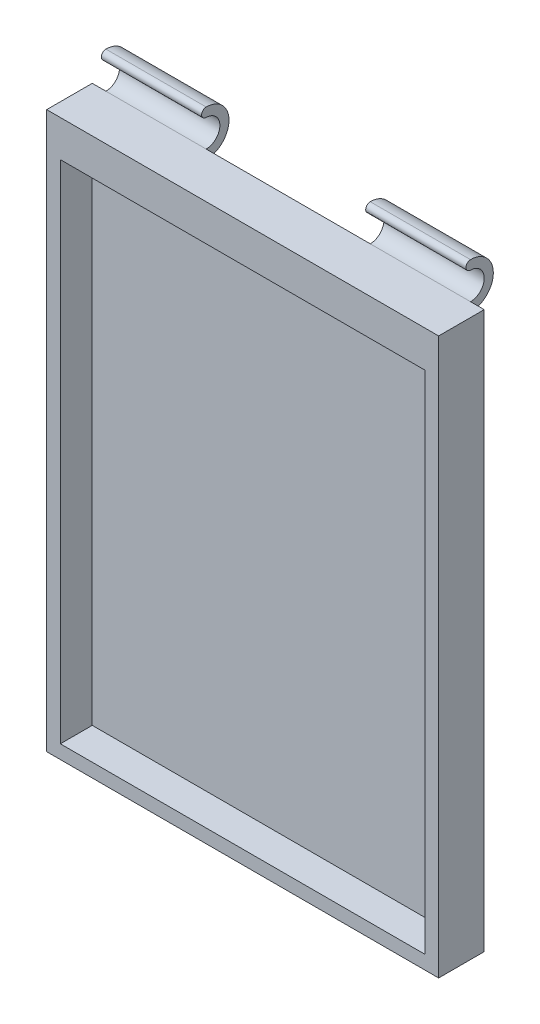
ISO-10303-21;
HEADER;
FILE_DESCRIPTION(('STEP AP214'),'2;1');
FILE_NAME('part.step','',(''),(''),'','','');
FILE_SCHEMA(('AUTOMOTIVE_DESIGN { 1 0 10303 214 1 1 1 1 }'));
ENDSEC;
DATA;
#1=APPLICATION_CONTEXT('core data for automotive mechanical design processes');
#2=APPLICATION_PROTOCOL_DEFINITION('international standard','automotive_design',2000,#1);
#3=PRODUCT_CONTEXT('',#1,'mechanical');
#4=PRODUCT('Part','Part','',(#3));
#5=PRODUCT_RELATED_PRODUCT_CATEGORY('part','',(#4));
#6=PRODUCT_DEFINITION_FORMATION('','',#4);
#7=PRODUCT_DEFINITION_CONTEXT('part definition',#1,'design');
#8=PRODUCT_DEFINITION('design','',#6,#7);
#9=PRODUCT_DEFINITION_SHAPE('','',#8);
#10=(LENGTH_UNIT() NAMED_UNIT(*) SI_UNIT(.MILLI.,.METRE.));
#11=(NAMED_UNIT(*) PLANE_ANGLE_UNIT() SI_UNIT($,.RADIAN.));
#12=(NAMED_UNIT(*) SI_UNIT($,.STERADIAN.) SOLID_ANGLE_UNIT());
#13=UNCERTAINTY_MEASURE_WITH_UNIT(LENGTH_MEASURE(1.E-05),#10,'distance_accuracy_value','');
#14=(GEOMETRIC_REPRESENTATION_CONTEXT(3) GLOBAL_UNCERTAINTY_ASSIGNED_CONTEXT((#13)) GLOBAL_UNIT_ASSIGNED_CONTEXT((#10,
#11,#12)) REPRESENTATION_CONTEXT('',''));
#15=CARTESIAN_POINT('',(0.,0.,0.));
#16=DIRECTION('',(0.,0.,1.));
#17=DIRECTION('',(1.,0.,0.));
#18=AXIS2_PLACEMENT_3D('',#15,#16,#17);
#19=CARTESIAN_POINT('',(-59.8956587101312,85.6025891829689,0.));
#20=DIRECTION('',(1.,0.,0.));
#21=DIRECTION('',(0.,0.,-1.));
#22=AXIS2_PLACEMENT_3D('',#19,#20,#21);
#23=CYLINDRICAL_SURFACE('',#22,5.);
#24=DIRECTION('',(1.,0.,0.));
#25=VECTOR('',#24,1.);
#26=CARTESIAN_POINT('',(-59.8956587101312,80.6025891829689,0.));
#27=LINE('',#26,#25);
#28=CARTESIAN_POINT('',(-37.046225468852,80.6025891829689,0.));
#29=VERTEX_POINT('',#28);
#30=CARTESIAN_POINT('',(-15.046225468852,80.6025891829689,0.));
#31=VERTEX_POINT('',#30);
#32=EDGE_CURVE('E164',#29,#31,#27,.T.);
#33=ORIENTED_EDGE('',*,*,#32,.F.);
#34=CARTESIAN_POINT('',(-37.046225468852,85.6025891829689,0.));
#35=DIRECTION('',(-1.,0.,0.));
#36=DIRECTION('',(0.,0.,1.));
#37=AXIS2_PLACEMENT_3D('',#34,#35,#36);
#38=CIRCLE('',#37,5.);
#39=CARTESIAN_POINT('',(-37.046225468852,90.6025891829689,0.));
#40=VERTEX_POINT('',#39);
#41=EDGE_CURVE('E11',#29,#40,#38,.F.);
#42=ORIENTED_EDGE('',*,*,#41,.T.);
#43=DIRECTION('',(1.,0.,0.));
#44=VECTOR('',#43,1.);
#45=CARTESIAN_POINT('',(-59.8956587101312,90.6025891829689,0.));
#46=LINE('',#45,#44);
#47=CARTESIAN_POINT('',(-15.046225468852,90.6025891829689,0.));
#48=VERTEX_POINT('',#47);
#49=EDGE_CURVE('E174',#40,#48,#46,.T.);
#50=ORIENTED_EDGE('',*,*,#49,.T.);
#51=CARTESIAN_POINT('',(-15.046225468852,85.6025891829689,0.));
#52=DIRECTION('',(1.,0.,0.));
#53=DIRECTION('',(0.,0.,-1.));
#54=AXIS2_PLACEMENT_3D('',#51,#52,#53);
#55=CIRCLE('',#54,5.);
#56=EDGE_CURVE('E44',#48,#31,#55,.F.);
#57=ORIENTED_EDGE('',*,*,#56,.T.);
#58=EDGE_LOOP('',(#33,#42,#50,#57));
#59=FACE_BOUND('',#58,.T.);
#60=ADVANCED_FACE('F36',(#59),#23,.T.);
#61=CARTESIAN_POINT('',(45.953774531148,77.6025891829689,10.));
#62=DIRECTION('',(-1.,0.,0.));
#63=DIRECTION('',(0.,0.,1.));
#64=AXIS2_PLACEMENT_3D('',#61,#62,#63);
#65=PLANE('',#64);
#66=DIRECTION('',(0.,1.,0.));
#67=VECTOR('',#66,1.);
#68=CARTESIAN_POINT('',(45.953774531148,77.6025891829689,0.));
#69=LINE('',#68,#67);
#70=CARTESIAN_POINT('',(45.953774531148,-39.3974108170311,0.));
#71=VERTEX_POINT('',#70);
#72=CARTESIAN_POINT('',(45.953774531148,82.6025891829689,0.));
#73=VERTEX_POINT('',#72);
#74=EDGE_CURVE('E210',#71,#73,#69,.T.);
#75=ORIENTED_EDGE('',*,*,#74,.T.);
#76=DIRECTION('',(0.,0.,1.));
#77=VECTOR('',#76,1.);
#78=CARTESIAN_POINT('',(45.953774531148,82.6025891829689,0.));
#79=LINE('',#78,#77);
#80=CARTESIAN_POINT('',(45.953774531148,82.6025891829689,10.));
#81=VERTEX_POINT('',#80);
#82=EDGE_CURVE('E177',#73,#81,#79,.T.);
#83=ORIENTED_EDGE('',*,*,#82,.T.);
#84=DIRECTION('',(0.,1.,0.));
#85=VECTOR('',#84,1.);
#86=CARTESIAN_POINT('',(45.953774531148,77.6025891829689,10.));
#87=LINE('',#86,#85);
#88=CARTESIAN_POINT('',(45.953774531148,-39.3974108170311,10.));
#89=VERTEX_POINT('',#88);
#90=EDGE_CURVE('E212',#89,#81,#87,.T.);
#91=ORIENTED_EDGE('',*,*,#90,.F.);
#92=DIRECTION('',(0.,0.,-1.));
#93=VECTOR('',#92,1.);
#94=CARTESIAN_POINT('',(45.953774531148,-39.3974108170311,10.));
#95=LINE('',#94,#93);
#96=EDGE_CURVE('E215',#89,#71,#95,.T.);
#97=ORIENTED_EDGE('',*,*,#96,.T.);
#98=EDGE_LOOP('',(#75,#83,#91,#97));
#99=FACE_BOUND('',#98,.T.);
#100=ADVANCED_FACE('F318',(#99),#65,.F.);
#101=CARTESIAN_POINT('',(-59.8956587101312,85.6025891829689,0.));
#102=DIRECTION('',(1.,0.,0.));
#103=DIRECTION('',(0.,0.,-1.));
#104=AXIS2_PLACEMENT_3D('',#101,#102,#103);
#105=CYLINDRICAL_SURFACE('',#104,3.);
#106=DIRECTION('',(1.,0.,0.));
#107=VECTOR('',#106,1.);
#108=CARTESIAN_POINT('',(-59.8956587101312,88.6025891829689,0.));
#109=LINE('',#108,#107);
#110=CARTESIAN_POINT('',(-37.046225468852,88.6025891829689,0.));
#111=VERTEX_POINT('',#110);
#112=CARTESIAN_POINT('',(-15.046225468852,88.6025891829689,0.));
#113=VERTEX_POINT('',#112);
#114=EDGE_CURVE('E278',#111,#113,#109,.T.);
#115=ORIENTED_EDGE('',*,*,#114,.F.);
#116=CARTESIAN_POINT('',(-37.046225468852,85.6025891829689,0.));
#117=DIRECTION('',(-1.,0.,0.));
#118=DIRECTION('',(0.,0.,1.));
#119=AXIS2_PLACEMENT_3D('',#116,#117,#118);
#120=CIRCLE('',#119,3.);
#121=CARTESIAN_POINT('',(-37.046225468852,82.6025891829689,0.));
#122=VERTEX_POINT('',#121);
#123=EDGE_CURVE('E267',#111,#122,#120,.T.);
#124=ORIENTED_EDGE('',*,*,#123,.T.);
#125=DIRECTION('',(1.,0.,0.));
#126=VECTOR('',#125,1.);
#127=CARTESIAN_POINT('',(-59.8956587101312,82.6025891829689,0.));
#128=LINE('',#127,#126);
#129=CARTESIAN_POINT('',(-15.046225468852,82.6025891829689,0.));
#130=VERTEX_POINT('',#129);
#131=EDGE_CURVE('E275',#122,#130,#128,.T.);
#132=ORIENTED_EDGE('',*,*,#131,.T.);
#133=CARTESIAN_POINT('',(-15.046225468852,85.6025891829689,0.));
#134=DIRECTION('',(1.,0.,0.));
#135=DIRECTION('',(0.,0.,-1.));
#136=AXIS2_PLACEMENT_3D('',#133,#134,#135);
#137=CIRCLE('',#136,3.);
#138=EDGE_CURVE('E263',#130,#113,#137,.T.);
#139=ORIENTED_EDGE('',*,*,#138,.T.);
#140=EDGE_LOOP('',(#115,#124,#132,#139));
#141=FACE_BOUND('',#140,.T.);
#142=ADVANCED_FACE('F288',(#141),#105,.F.);
#143=CARTESIAN_POINT('',(20.953774531148,88.6025891829689,0.));
#144=VERTEX_POINT('',#143);
#145=CARTESIAN_POINT('',(42.9537745311479,88.6025891829689,0.));
#146=VERTEX_POINT('',#145);
#147=EDGE_CURVE('E249',#144,#146,#109,.T.);
#148=ORIENTED_EDGE('',*,*,#147,.F.);
#149=CARTESIAN_POINT('',(20.953774531148,85.6025891829689,0.));
#150=DIRECTION('',(-1.,0.,0.));
#151=DIRECTION('',(0.,0.,1.));
#152=AXIS2_PLACEMENT_3D('',#149,#150,#151);
#153=CIRCLE('',#152,3.);
#154=CARTESIAN_POINT('',(20.953774531148,82.6025891829689,0.));
#155=VERTEX_POINT('',#154);
#156=EDGE_CURVE('E241',#144,#155,#153,.T.);
#157=ORIENTED_EDGE('',*,*,#156,.T.);
#158=CARTESIAN_POINT('',(42.9537745311479,82.6025891829689,0.));
#159=VERTEX_POINT('',#158);
#160=EDGE_CURVE('E276',#155,#159,#128,.T.);
#161=ORIENTED_EDGE('',*,*,#160,.T.);
#162=CARTESIAN_POINT('',(42.9537745311479,85.6025891829689,0.));
#163=DIRECTION('',(1.,0.,0.));
#164=DIRECTION('',(0.,0.,-1.));
#165=AXIS2_PLACEMENT_3D('',#162,#163,#164);
#166=CIRCLE('',#165,3.);
#167=EDGE_CURVE('E245',#159,#146,#166,.T.);
#168=ORIENTED_EDGE('',*,*,#167,.T.);
#169=EDGE_LOOP('',(#148,#157,#161,#168));
#170=FACE_BOUND('',#169,.T.);
#171=ADVANCED_FACE('F310',(#170),#105,.F.);
#172=CARTESIAN_POINT('',(-59.8956587101312,89.6025891829689,0.));
#173=DIRECTION('',(1.,0.,0.));
#174=DIRECTION('',(0.,0.,-1.));
#175=AXIS2_PLACEMENT_3D('',#172,#173,#174);
#176=CYLINDRICAL_SURFACE('',#175,1.);
#177=ORIENTED_EDGE('',*,*,#49,.F.);
#178=CARTESIAN_POINT('',(-37.046225468852,89.6025891829689,0.));
#179=DIRECTION('',(-1.,0.,0.));
#180=DIRECTION('',(0.,0.,1.));
#181=AXIS2_PLACEMENT_3D('',#178,#179,#180);
#182=CIRCLE('',#181,1.);
#183=EDGE_CURVE('E156',#40,#111,#182,.F.);
#184=ORIENTED_EDGE('',*,*,#183,.T.);
#185=ORIENTED_EDGE('',*,*,#114,.T.);
#186=CARTESIAN_POINT('',(-15.046225468852,89.6025891829689,0.));
#187=DIRECTION('',(1.,0.,0.));
#188=DIRECTION('',(0.,0.,-1.));
#189=AXIS2_PLACEMENT_3D('',#186,#187,#188);
#190=CIRCLE('',#189,1.);
#191=EDGE_CURVE('E260',#113,#48,#190,.F.);
#192=ORIENTED_EDGE('',*,*,#191,.T.);
#193=EDGE_LOOP('',(#177,#184,#185,#192));
#194=FACE_BOUND('',#193,.T.);
#195=ADVANCED_FACE('F281',(#194),#176,.T.);
#196=CARTESIAN_POINT('',(20.953774531148,90.6025891829689,0.));
#197=VERTEX_POINT('',#196);
#198=CARTESIAN_POINT('',(42.9537745311479,90.6025891829689,0.));
#199=VERTEX_POINT('',#198);
#200=EDGE_CURVE('E170',#197,#199,#46,.T.);
#201=ORIENTED_EDGE('',*,*,#200,.F.);
#202=CARTESIAN_POINT('',(20.953774531148,89.6025891829689,0.));
#203=DIRECTION('',(-1.,0.,0.));
#204=DIRECTION('',(0.,0.,1.));
#205=AXIS2_PLACEMENT_3D('',#202,#203,#204);
#206=CIRCLE('',#205,1.);
#207=EDGE_CURVE('E238',#197,#144,#206,.F.);
#208=ORIENTED_EDGE('',*,*,#207,.T.);
#209=ORIENTED_EDGE('',*,*,#147,.T.);
#210=CARTESIAN_POINT('',(42.9537745311479,89.6025891829689,0.));
#211=DIRECTION('',(1.,0.,0.));
#212=DIRECTION('',(0.,0.,-1.));
#213=AXIS2_PLACEMENT_3D('',#210,#211,#212);
#214=CIRCLE('',#213,1.);
#215=EDGE_CURVE('E167',#146,#199,#214,.F.);
#216=ORIENTED_EDGE('',*,*,#215,.T.);
#217=EDGE_LOOP('',(#201,#208,#209,#216));
#218=FACE_BOUND('',#217,.T.);
#219=ADVANCED_FACE('F248',(#218),#176,.T.);
#220=CARTESIAN_POINT('',(42.9537745311479,85.6025891829689,0.));
#221=DIRECTION('',(1.,0.,0.));
#222=DIRECTION('',(0.,0.,-1.));
#223=AXIS2_PLACEMENT_3D('',#220,#221,#222);
#224=CIRCLE('',#223,5.);
#225=CARTESIAN_POINT('',(42.9537745311479,80.6025891829689,0.));
#226=VERTEX_POINT('',#225);
#227=EDGE_CURVE('E226',#199,#226,#224,.F.);
#228=ORIENTED_EDGE('',*,*,#227,.T.);
#229=CARTESIAN_POINT('',(20.953774531148,80.6025891829689,0.));
#230=VERTEX_POINT('',#229);
#231=EDGE_CURVE('E171',#230,#226,#27,.T.);
#232=ORIENTED_EDGE('',*,*,#231,.F.);
#233=CARTESIAN_POINT('',(20.953774531148,85.6025891829689,0.));
#234=DIRECTION('',(-1.,0.,0.));
#235=DIRECTION('',(0.,0.,1.));
#236=AXIS2_PLACEMENT_3D('',#233,#234,#235);
#237=CIRCLE('',#236,5.);
#238=EDGE_CURVE('E228',#230,#197,#237,.F.);
#239=ORIENTED_EDGE('',*,*,#238,.T.);
#240=ORIENTED_EDGE('',*,*,#200,.T.);
#241=EDGE_LOOP('',(#228,#232,#239,#240));
#242=FACE_BOUND('',#241,.T.);
#243=ADVANCED_FACE('F232',(#242),#23,.T.);
#244=CARTESIAN_POINT('',(0.,0.,10.));
#245=DIRECTION('',(0.,0.,1.));
#246=DIRECTION('',(1.,0.,0.));
#247=AXIS2_PLACEMENT_3D('',#244,#245,#246);
#248=PLANE('',#247);
#249=DIRECTION('',(0.,-1.,0.));
#250=VECTOR('',#249,1.);
#251=CARTESIAN_POINT('',(-40.046225468852,77.6025891829689,10.));
#252=LINE('',#251,#250);
#253=CARTESIAN_POINT('',(-40.046225468852,82.6025891829689,10.));
#254=VERTEX_POINT('',#253);
#255=CARTESIAN_POINT('',(-40.046225468852,-39.3974108170311,10.));
#256=VERTEX_POINT('',#255);
#257=EDGE_CURVE('E206',#254,#256,#252,.T.);
#258=ORIENTED_EDGE('',*,*,#257,.T.);
#259=DIRECTION('',(1.,0.,0.));
#260=VECTOR('',#259,1.);
#261=CARTESIAN_POINT('',(-40.046225468852,-39.3974108170311,10.));
#262=LINE('',#261,#260);
#263=EDGE_CURVE('E209',#256,#89,#262,.T.);
#264=ORIENTED_EDGE('',*,*,#263,.T.);
#265=ORIENTED_EDGE('',*,*,#90,.T.);
#266=DIRECTION('',(1.,0.,0.));
#267=VECTOR('',#266,1.);
#268=CARTESIAN_POINT('',(-59.8956587101312,82.6025891829689,10.));
#269=LINE('',#268,#267);
#270=EDGE_CURVE('E271',#254,#81,#269,.T.);
#271=ORIENTED_EDGE('',*,*,#270,.F.);
#272=EDGE_LOOP('',(#258,#264,#265,#271));
#273=FACE_BOUND('',#272,.T.);
#274=DIRECTION('',(1.,0.,0.));
#275=VECTOR('',#274,1.);
#276=CARTESIAN_POINT('',(-37.046225468852,-36.3974108170311,10.));
#277=LINE('',#276,#275);
#278=CARTESIAN_POINT('',(-37.046225468852,-36.3974108170311,10.));
#279=VERTEX_POINT('',#278);
#280=CARTESIAN_POINT('',(42.953774531148,-36.3974108170311,10.));
#281=VERTEX_POINT('',#280);
#282=EDGE_CURVE('E190',#279,#281,#277,.T.);
#283=ORIENTED_EDGE('',*,*,#282,.F.);
#284=DIRECTION('',(0.,-1.,0.));
#285=VECTOR('',#284,1.);
#286=CARTESIAN_POINT('',(-37.046225468852,74.6025891829689,10.));
#287=LINE('',#286,#285);
#288=CARTESIAN_POINT('',(-37.046225468852,74.6025891829689,10.));
#289=VERTEX_POINT('',#288);
#290=EDGE_CURVE('E188',#289,#279,#287,.T.);
#291=ORIENTED_EDGE('',*,*,#290,.F.);
#292=DIRECTION('',(-1.,0.,0.));
#293=VECTOR('',#292,1.);
#294=CARTESIAN_POINT('',(-37.046225468852,74.6025891829689,10.));
#295=LINE('',#294,#293);
#296=CARTESIAN_POINT('',(42.953774531148,74.6025891829689,10.));
#297=VERTEX_POINT('',#296);
#298=EDGE_CURVE('E195',#297,#289,#295,.T.);
#299=ORIENTED_EDGE('',*,*,#298,.F.);
#300=DIRECTION('',(0.,1.,0.));
#301=VECTOR('',#300,1.);
#302=CARTESIAN_POINT('',(42.953774531148,74.6025891829689,10.));
#303=LINE('',#302,#301);
#304=EDGE_CURVE('E192',#281,#297,#303,.T.);
#305=ORIENTED_EDGE('',*,*,#304,.F.);
#306=EDGE_LOOP('',(#283,#291,#299,#305));
#307=FACE_BOUND('',#306,.T.);
#308=ADVANCED_FACE('F329',(#273,#307),#248,.T.);
#309=CARTESIAN_POINT('',(0.,0.,0.));
#310=DIRECTION('',(0.,0.,1.));
#311=DIRECTION('',(1.,0.,0.));
#312=AXIS2_PLACEMENT_3D('',#309,#310,#311);
#313=PLANE('',#312);
#314=DIRECTION('',(0.,-1.,0.));
#315=VECTOR('',#314,1.);
#316=CARTESIAN_POINT('',(-40.046225468852,77.6025891829689,0.));
#317=LINE('',#316,#315);
#318=CARTESIAN_POINT('',(-40.046225468852,82.6025891829689,0.));
#319=VERTEX_POINT('',#318);
#320=CARTESIAN_POINT('',(-40.046225468852,-39.3974108170311,0.));
#321=VERTEX_POINT('',#320);
#322=EDGE_CURVE('E205',#319,#321,#317,.T.);
#323=ORIENTED_EDGE('',*,*,#322,.F.);
#324=DIRECTION('',(1.,0.,0.));
#325=VECTOR('',#324,1.);
#326=CARTESIAN_POINT('',(-40.046225468852,82.6025891829689,0.));
#327=LINE('',#326,#325);
#328=EDGE_CURVE('E166',#319,#122,#327,.T.);
#329=ORIENTED_EDGE('',*,*,#328,.T.);
#330=DIRECTION('',(0.,1.,0.));
#331=VECTOR('',#330,1.);
#332=CARTESIAN_POINT('',(-37.046225468852,80.6025891829689,0.));
#333=LINE('',#332,#331);
#334=EDGE_CURVE('E153',#29,#122,#333,.T.);
#335=ORIENTED_EDGE('',*,*,#334,.F.);
#336=ORIENTED_EDGE('',*,*,#32,.T.);
#337=DIRECTION('',(0.,1.,0.));
#338=VECTOR('',#337,1.);
#339=CARTESIAN_POINT('',(-15.046225468852,80.6025891829689,0.));
#340=LINE('',#339,#338);
#341=EDGE_CURVE('E298',#31,#130,#340,.T.);
#342=ORIENTED_EDGE('',*,*,#341,.T.);
#343=DIRECTION('',(1.,0.,0.));
#344=VECTOR('',#343,1.);
#345=CARTESIAN_POINT('',(-15.046225468852,82.6025891829689,0.));
#346=LINE('',#345,#344);
#347=EDGE_CURVE('E295',#130,#155,#346,.T.);
#348=ORIENTED_EDGE('',*,*,#347,.T.);
#349=DIRECTION('',(0.,1.,0.));
#350=VECTOR('',#349,1.);
#351=CARTESIAN_POINT('',(20.953774531148,80.6025891829689,0.));
#352=LINE('',#351,#350);
#353=EDGE_CURVE('E256',#230,#155,#352,.T.);
#354=ORIENTED_EDGE('',*,*,#353,.F.);
#355=ORIENTED_EDGE('',*,*,#231,.T.);
#356=DIRECTION('',(0.,1.,0.));
#357=VECTOR('',#356,1.);
#358=CARTESIAN_POINT('',(42.9537745311479,80.6025891829689,0.));
#359=LINE('',#358,#357);
#360=EDGE_CURVE('E300',#226,#159,#359,.T.);
#361=ORIENTED_EDGE('',*,*,#360,.T.);
#362=DIRECTION('',(1.,0.,0.));
#363=VECTOR('',#362,1.);
#364=CARTESIAN_POINT('',(45.953774531148,82.6025891829689,0.));
#365=LINE('',#364,#363);
#366=EDGE_CURVE('E302',#159,#73,#365,.T.);
#367=ORIENTED_EDGE('',*,*,#366,.T.);
#368=ORIENTED_EDGE('',*,*,#74,.F.);
#369=DIRECTION('',(1.,0.,0.));
#370=VECTOR('',#369,1.);
#371=CARTESIAN_POINT('',(-40.046225468852,-39.3974108170311,0.));
#372=LINE('',#371,#370);
#373=EDGE_CURVE('E218',#321,#71,#372,.T.);
#374=ORIENTED_EDGE('',*,*,#373,.F.);
#375=EDGE_LOOP('',(#323,#329,#335,#336,#342,#348,#354,#355,#361,#367,#368,#374));
#376=FACE_BOUND('',#375,.T.);
#377=ADVANCED_FACE('F163',(#376),#313,.F.);
#378=CARTESIAN_POINT('',(-40.046225468852,77.6025891829689,10.));
#379=DIRECTION('',(1.,0.,0.));
#380=DIRECTION('',(0.,0.,-1.));
#381=AXIS2_PLACEMENT_3D('',#378,#379,#380);
#382=PLANE('',#381);
#383=DIRECTION('',(0.,0.,-1.));
#384=VECTOR('',#383,1.);
#385=CARTESIAN_POINT('',(-40.046225468852,82.6025891829689,0.));
#386=LINE('',#385,#384);
#387=EDGE_CURVE('E182',#254,#319,#386,.T.);
#388=ORIENTED_EDGE('',*,*,#387,.T.);
#389=ORIENTED_EDGE('',*,*,#322,.T.);
#390=DIRECTION('',(0.,0.,-1.));
#391=VECTOR('',#390,1.);
#392=CARTESIAN_POINT('',(-40.046225468852,-39.3974108170311,10.));
#393=LINE('',#392,#391);
#394=EDGE_CURVE('E223',#256,#321,#393,.T.);
#395=ORIENTED_EDGE('',*,*,#394,.F.);
#396=ORIENTED_EDGE('',*,*,#257,.F.);
#397=EDGE_LOOP('',(#388,#389,#395,#396));
#398=FACE_BOUND('',#397,.T.);
#399=ADVANCED_FACE('F38',(#398),#382,.F.);
#400=CARTESIAN_POINT('',(-40.046225468852,-39.3974108170311,10.));
#401=DIRECTION('',(0.,1.,0.));
#402=DIRECTION('',(0.,0.,1.));
#403=AXIS2_PLACEMENT_3D('',#400,#401,#402);
#404=PLANE('',#403);
#405=ORIENTED_EDGE('',*,*,#373,.T.);
#406=ORIENTED_EDGE('',*,*,#96,.F.);
#407=ORIENTED_EDGE('',*,*,#263,.F.);
#408=ORIENTED_EDGE('',*,*,#394,.T.);
#409=EDGE_LOOP('',(#405,#406,#407,#408));
#410=FACE_BOUND('',#409,.T.);
#411=ADVANCED_FACE('F394',(#410),#404,.F.);
#412=CARTESIAN_POINT('',(-37.046225468852,74.6025891829689,10.));
#413=DIRECTION('',(1.,0.,0.));
#414=DIRECTION('',(0.,1.,0.));
#415=AXIS2_PLACEMENT_3D('',#412,#413,#414);
#416=PLANE('',#415);
#417=DIRECTION('',(0.,-1.,0.));
#418=VECTOR('',#417,1.);
#419=CARTESIAN_POINT('',(-37.046225468852,0.,3.));
#420=LINE('',#419,#418);
#421=CARTESIAN_POINT('',(-37.046225468852,74.6025891829689,3.));
#422=VERTEX_POINT('',#421);
#423=CARTESIAN_POINT('',(-37.046225468852,-36.3974108170311,3.));
#424=VERTEX_POINT('',#423);
#425=EDGE_CURVE('E184',#422,#424,#420,.T.);
#426=ORIENTED_EDGE('',*,*,#425,.F.);
#427=DIRECTION('',(0.,0.,-1.));
#428=VECTOR('',#427,1.);
#429=CARTESIAN_POINT('',(-37.046225468852,74.6025891829689,10.));
#430=LINE('',#429,#428);
#431=EDGE_CURVE('E197',#289,#422,#430,.T.);
#432=ORIENTED_EDGE('',*,*,#431,.F.);
#433=ORIENTED_EDGE('',*,*,#290,.T.);
#434=DIRECTION('',(0.,0.,-1.));
#435=VECTOR('',#434,1.);
#436=CARTESIAN_POINT('',(-37.046225468852,-36.3974108170311,10.));
#437=LINE('',#436,#435);
#438=EDGE_CURVE('E203',#279,#424,#437,.T.);
#439=ORIENTED_EDGE('',*,*,#438,.T.);
#440=EDGE_LOOP('',(#426,#432,#433,#439));
#441=FACE_BOUND('',#440,.T.);
#442=ADVANCED_FACE('F385',(#441),#416,.T.);
#443=CARTESIAN_POINT('',(-37.046225468852,-36.3974108170311,10.));
#444=DIRECTION('',(0.,1.,0.));
#445=DIRECTION('',(0.,0.,1.));
#446=AXIS2_PLACEMENT_3D('',#443,#444,#445);
#447=PLANE('',#446);
#448=DIRECTION('',(1.,0.,0.));
#449=VECTOR('',#448,1.);
#450=CARTESIAN_POINT('',(0.,-36.3974108170311,3.));
#451=LINE('',#450,#449);
#452=CARTESIAN_POINT('',(42.953774531148,-36.3974108170311,3.));
#453=VERTEX_POINT('',#452);
#454=EDGE_CURVE('E51',#424,#453,#451,.T.);
#455=ORIENTED_EDGE('',*,*,#454,.F.);
#456=ORIENTED_EDGE('',*,*,#438,.F.);
#457=ORIENTED_EDGE('',*,*,#282,.T.);
#458=DIRECTION('',(0.,0.,-1.));
#459=VECTOR('',#458,1.);
#460=CARTESIAN_POINT('',(42.953774531148,-36.3974108170311,10.));
#461=LINE('',#460,#459);
#462=EDGE_CURVE('E201',#281,#453,#461,.T.);
#463=ORIENTED_EDGE('',*,*,#462,.T.);
#464=EDGE_LOOP('',(#455,#456,#457,#463));
#465=FACE_BOUND('',#464,.T.);
#466=ADVANCED_FACE('F376',(#465),#447,.T.);
#467=CARTESIAN_POINT('',(42.953774531148,74.6025891829689,10.));
#468=DIRECTION('',(-1.,0.,0.));
#469=DIRECTION('',(0.,-1.,0.));
#470=AXIS2_PLACEMENT_3D('',#467,#468,#469);
#471=PLANE('',#470);
#472=DIRECTION('',(0.,-1.,0.));
#473=VECTOR('',#472,1.);
#474=CARTESIAN_POINT('',(42.953774531148,0.,3.));
#475=LINE('',#474,#473);
#476=CARTESIAN_POINT('',(42.953774531148,74.6025891829689,3.));
#477=VERTEX_POINT('',#476);
#478=EDGE_CURVE('E59',#477,#453,#475,.T.);
#479=ORIENTED_EDGE('',*,*,#478,.T.);
#480=ORIENTED_EDGE('',*,*,#462,.F.);
#481=ORIENTED_EDGE('',*,*,#304,.T.);
#482=DIRECTION('',(0.,0.,-1.));
#483=VECTOR('',#482,1.);
#484=CARTESIAN_POINT('',(42.953774531148,74.6025891829689,10.));
#485=LINE('',#484,#483);
#486=EDGE_CURVE('E199',#297,#477,#485,.T.);
#487=ORIENTED_EDGE('',*,*,#486,.T.);
#488=EDGE_LOOP('',(#479,#480,#481,#487));
#489=FACE_BOUND('',#488,.T.);
#490=ADVANCED_FACE('F366',(#489),#471,.T.);
#491=CARTESIAN_POINT('',(-37.046225468852,74.6025891829689,10.));
#492=DIRECTION('',(0.,-1.,0.));
#493=DIRECTION('',(0.,0.,-1.));
#494=AXIS2_PLACEMENT_3D('',#491,#492,#493);
#495=PLANE('',#494);
#496=DIRECTION('',(1.,0.,0.));
#497=VECTOR('',#496,1.);
#498=CARTESIAN_POINT('',(0.,74.6025891829689,3.));
#499=LINE('',#498,#497);
#500=EDGE_CURVE('E181',#422,#477,#499,.T.);
#501=ORIENTED_EDGE('',*,*,#500,.T.);
#502=ORIENTED_EDGE('',*,*,#486,.F.);
#503=ORIENTED_EDGE('',*,*,#298,.T.);
#504=ORIENTED_EDGE('',*,*,#431,.T.);
#505=EDGE_LOOP('',(#501,#502,#503,#504));
#506=FACE_BOUND('',#505,.T.);
#507=ADVANCED_FACE('F354',(#506),#495,.T.);
#508=CARTESIAN_POINT('',(0.,0.,3.));
#509=DIRECTION('',(0.,0.,1.));
#510=DIRECTION('',(1.,0.,0.));
#511=AXIS2_PLACEMENT_3D('',#508,#509,#510);
#512=PLANE('',#511);
#513=ORIENTED_EDGE('',*,*,#478,.F.);
#514=ORIENTED_EDGE('',*,*,#500,.F.);
#515=ORIENTED_EDGE('',*,*,#425,.T.);
#516=ORIENTED_EDGE('',*,*,#454,.T.);
#517=EDGE_LOOP('',(#513,#514,#515,#516));
#518=FACE_BOUND('',#517,.T.);
#519=ADVANCED_FACE('F349',(#518),#512,.T.);
#520=CARTESIAN_POINT('',(-59.8956587101312,82.6025891829689,0.));
#521=DIRECTION('',(0.,1.,0.));
#522=DIRECTION('',(0.,0.,1.));
#523=AXIS2_PLACEMENT_3D('',#520,#521,#522);
#524=PLANE('',#523);
#525=ORIENTED_EDGE('',*,*,#328,.F.);
#526=ORIENTED_EDGE('',*,*,#387,.F.);
#527=ORIENTED_EDGE('',*,*,#270,.T.);
#528=ORIENTED_EDGE('',*,*,#82,.F.);
#529=ORIENTED_EDGE('',*,*,#366,.F.);
#530=ORIENTED_EDGE('',*,*,#160,.F.);
#531=ORIENTED_EDGE('',*,*,#347,.F.);
#532=ORIENTED_EDGE('',*,*,#131,.F.);
#533=EDGE_LOOP('',(#525,#526,#527,#528,#529,#530,#531,#532));
#534=FACE_BOUND('',#533,.T.);
#535=ADVANCED_FACE('F292',(#534),#524,.T.);
#536=CARTESIAN_POINT('',(42.9537745311479,92.6025891829689,10.));
#537=DIRECTION('',(1.,0.,0.));
#538=DIRECTION('',(0.,0.,-1.));
#539=AXIS2_PLACEMENT_3D('',#536,#537,#538);
#540=PLANE('',#539);
#541=ORIENTED_EDGE('',*,*,#167,.F.);
#542=ORIENTED_EDGE('',*,*,#360,.F.);
#543=ORIENTED_EDGE('',*,*,#227,.F.);
#544=ORIENTED_EDGE('',*,*,#215,.F.);
#545=EDGE_LOOP('',(#541,#542,#543,#544));
#546=FACE_BOUND('',#545,.T.);
#547=ADVANCED_FACE('F308',(#546),#540,.T.);
#548=CARTESIAN_POINT('',(-15.046225468852,92.6025891829689,10.));
#549=DIRECTION('',(1.,0.,0.));
#550=DIRECTION('',(0.,0.,-1.));
#551=AXIS2_PLACEMENT_3D('',#548,#549,#550);
#552=PLANE('',#551);
#553=ORIENTED_EDGE('',*,*,#138,.F.);
#554=ORIENTED_EDGE('',*,*,#341,.F.);
#555=ORIENTED_EDGE('',*,*,#56,.F.);
#556=ORIENTED_EDGE('',*,*,#191,.F.);
#557=EDGE_LOOP('',(#553,#554,#555,#556));
#558=FACE_BOUND('',#557,.T.);
#559=ADVANCED_FACE('F285',(#558),#552,.T.);
#560=CARTESIAN_POINT('',(20.953774531148,92.6025891829689,10.));
#561=DIRECTION('',(-1.,0.,0.));
#562=DIRECTION('',(0.,0.,1.));
#563=AXIS2_PLACEMENT_3D('',#560,#561,#562);
#564=PLANE('',#563);
#565=ORIENTED_EDGE('',*,*,#207,.F.);
#566=ORIENTED_EDGE('',*,*,#238,.F.);
#567=ORIENTED_EDGE('',*,*,#353,.T.);
#568=ORIENTED_EDGE('',*,*,#156,.F.);
#569=EDGE_LOOP('',(#565,#566,#567,#568));
#570=FACE_BOUND('',#569,.T.);
#571=ADVANCED_FACE('F239',(#570),#564,.T.);
#572=CARTESIAN_POINT('',(-37.046225468852,92.6025891829689,10.));
#573=DIRECTION('',(-1.,0.,0.));
#574=DIRECTION('',(0.,0.,1.));
#575=AXIS2_PLACEMENT_3D('',#572,#573,#574);
#576=PLANE('',#575);
#577=ORIENTED_EDGE('',*,*,#183,.F.);
#578=ORIENTED_EDGE('',*,*,#41,.F.);
#579=ORIENTED_EDGE('',*,*,#334,.T.);
#580=ORIENTED_EDGE('',*,*,#123,.F.);
#581=EDGE_LOOP('',(#577,#578,#579,#580));
#582=FACE_BOUND('',#581,.T.);
#583=ADVANCED_FACE('F152',(#582),#576,.T.);
#584=CLOSED_SHELL('',(#60,#100,#142,#171,#195,#219,#243,#308,#377,#399,#411,#442,#466,#490,#507,
#519,#535,#547,#559,#571,#583));
#585=MANIFOLD_SOLID_BREP('B2',#584);
#586=ADVANCED_BREP_SHAPE_REPRESENTATION('',(#18,#585),#14);
#587=SHAPE_DEFINITION_REPRESENTATION(#9,#586);
ENDSEC;
END-ISO-10303-21;
